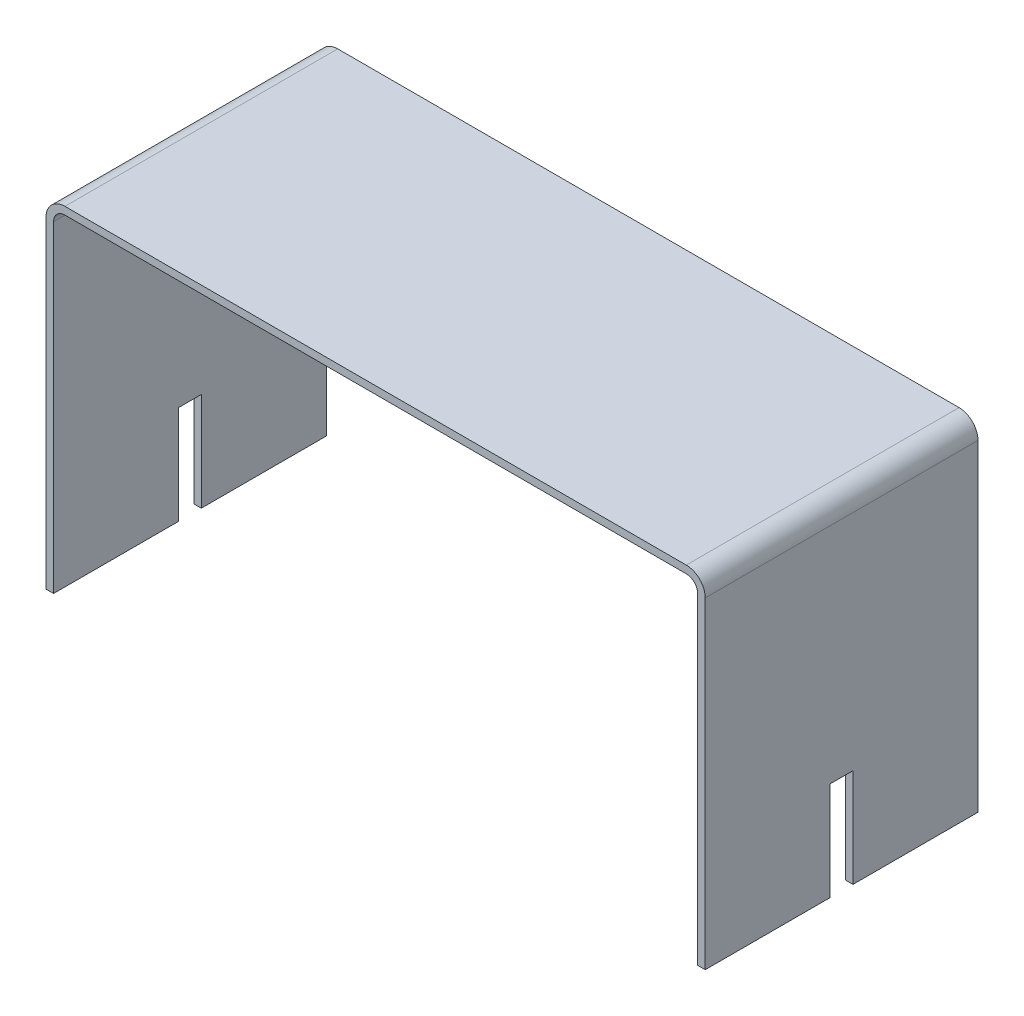
ISO-10303-21;
HEADER;
FILE_DESCRIPTION(('STEP AP214'),'2;1');
FILE_NAME('part.step','',(''),(''),'','','');
FILE_SCHEMA(('AUTOMOTIVE_DESIGN { 1 0 10303 214 1 1 1 1 }'));
ENDSEC;
DATA;
#1=APPLICATION_CONTEXT('core data for automotive mechanical design processes');
#2=APPLICATION_PROTOCOL_DEFINITION('international standard','automotive_design',2000,#1);
#3=PRODUCT_CONTEXT('',#1,'mechanical');
#4=PRODUCT('Part','Part','',(#3));
#5=PRODUCT_RELATED_PRODUCT_CATEGORY('part','',(#4));
#6=PRODUCT_DEFINITION_FORMATION('','',#4);
#7=PRODUCT_DEFINITION_CONTEXT('part definition',#1,'design');
#8=PRODUCT_DEFINITION('design','',#6,#7);
#9=PRODUCT_DEFINITION_SHAPE('','',#8);
#10=(LENGTH_UNIT() NAMED_UNIT(*) SI_UNIT(.MILLI.,.METRE.));
#11=(NAMED_UNIT(*) PLANE_ANGLE_UNIT() SI_UNIT($,.RADIAN.));
#12=(NAMED_UNIT(*) SI_UNIT($,.STERADIAN.) SOLID_ANGLE_UNIT());
#13=UNCERTAINTY_MEASURE_WITH_UNIT(LENGTH_MEASURE(1.E-05),#10,'distance_accuracy_value','');
#14=(GEOMETRIC_REPRESENTATION_CONTEXT(3) GLOBAL_UNCERTAINTY_ASSIGNED_CONTEXT((#13)) GLOBAL_UNIT_ASSIGNED_CONTEXT((#10,
#11,#12)) REPRESENTATION_CONTEXT('',''));
#15=CARTESIAN_POINT('',(0.,0.,0.));
#16=DIRECTION('',(0.,0.,1.));
#17=DIRECTION('',(1.,0.,0.));
#18=AXIS2_PLACEMENT_3D('',#15,#16,#17);
#19=CARTESIAN_POINT('',(42.,6.,1.5));
#20=DIRECTION('',(0.,0.,1.));
#21=DIRECTION('',(1.,0.,0.));
#22=AXIS2_PLACEMENT_3D('',#19,#20,#21);
#23=PLANE('',#22);
#24=DIRECTION('',(0.,-1.,0.));
#25=VECTOR('',#24,1.);
#26=CARTESIAN_POINT('',(43.5,27.75,1.5));
#27=LINE('',#26,#25);
#28=CARTESIAN_POINT('',(43.5,20.,1.5));
#29=VERTEX_POINT('',#28);
#30=CARTESIAN_POINT('',(43.5,7.,1.5));
#31=VERTEX_POINT('',#30);
#32=EDGE_CURVE('E324',#29,#31,#27,.T.);
#33=ORIENTED_EDGE('',*,*,#32,.T.);
#34=DIRECTION('',(-1.,0.,0.));
#35=VECTOR('',#34,1.);
#36=CARTESIAN_POINT('',(42.75,7.,1.5));
#37=LINE('',#36,#35);
#38=CARTESIAN_POINT('',(42.5,7.,1.5));
#39=VERTEX_POINT('',#38);
#40=EDGE_CURVE('E38',#31,#39,#37,.T.);
#41=ORIENTED_EDGE('',*,*,#40,.T.);
#42=DIRECTION('',(0.,1.,0.));
#43=VECTOR('',#42,1.);
#44=CARTESIAN_POINT('',(42.5,6.5,1.5));
#45=LINE('',#44,#43);
#46=CARTESIAN_POINT('',(42.5,20.,1.5));
#47=VERTEX_POINT('',#46);
#48=EDGE_CURVE('E306',#39,#47,#45,.T.);
#49=ORIENTED_EDGE('',*,*,#48,.T.);
#50=DIRECTION('',(1.,0.,0.));
#51=VECTOR('',#50,1.);
#52=CARTESIAN_POINT('',(42.,20.,1.5));
#53=LINE('',#52,#51);
#54=EDGE_CURVE('E11',#47,#29,#53,.T.);
#55=ORIENTED_EDGE('',*,*,#54,.T.);
#56=EDGE_LOOP('',(#33,#41,#49,#55));
#57=FACE_BOUND('',#56,.T.);
#58=ADVANCED_FACE('F17',(#57),#23,.F.);
#59=CARTESIAN_POINT('',(42.,20.,-1.5));
#60=DIRECTION('',(0.,1.,0.));
#61=DIRECTION('',(1.,0.,0.));
#62=AXIS2_PLACEMENT_3D('',#59,#60,#61);
#63=PLANE('',#62);
#64=DIRECTION('',(0.,0.,1.));
#65=VECTOR('',#64,1.);
#66=CARTESIAN_POINT('',(43.5,20.,-9.75));
#67=LINE('',#66,#65);
#68=CARTESIAN_POINT('',(43.5,20.,-1.5));
#69=VERTEX_POINT('',#68);
#70=EDGE_CURVE('E320',#69,#29,#67,.T.);
#71=ORIENTED_EDGE('',*,*,#70,.T.);
#72=ORIENTED_EDGE('',*,*,#54,.F.);
#73=DIRECTION('',(0.,0.,-1.));
#74=VECTOR('',#73,1.);
#75=CARTESIAN_POINT('',(42.5,20.,-9.75));
#76=LINE('',#75,#74);
#77=CARTESIAN_POINT('',(42.5,20.,-1.5));
#78=VERTEX_POINT('',#77);
#79=EDGE_CURVE('E413',#47,#78,#76,.T.);
#80=ORIENTED_EDGE('',*,*,#79,.T.);
#81=DIRECTION('',(1.,0.,0.));
#82=VECTOR('',#81,1.);
#83=CARTESIAN_POINT('',(42.,20.,-1.5));
#84=LINE('',#83,#82);
#85=EDGE_CURVE('E20',#78,#69,#84,.T.);
#86=ORIENTED_EDGE('',*,*,#85,.T.);
#87=EDGE_LOOP('',(#71,#72,#80,#86));
#88=FACE_BOUND('',#87,.T.);
#89=ADVANCED_FACE('F461',(#88),#63,.F.);
#90=CARTESIAN_POINT('',(42.,6.,-1.5));
#91=DIRECTION('',(0.,0.,1.));
#92=DIRECTION('',(1.,0.,0.));
#93=AXIS2_PLACEMENT_3D('',#90,#91,#92);
#94=PLANE('',#93);
#95=ORIENTED_EDGE('',*,*,#85,.F.);
#96=DIRECTION('',(0.,1.,0.));
#97=VECTOR('',#96,1.);
#98=CARTESIAN_POINT('',(42.5,6.5,-1.5));
#99=LINE('',#98,#97);
#100=CARTESIAN_POINT('',(42.5,7.,-1.5));
#101=VERTEX_POINT('',#100);
#102=EDGE_CURVE('E350',#101,#78,#99,.T.);
#103=ORIENTED_EDGE('',*,*,#102,.F.);
#104=DIRECTION('',(-1.,0.,0.));
#105=VECTOR('',#104,1.);
#106=CARTESIAN_POINT('',(42.75,7.,-1.5));
#107=LINE('',#106,#105);
#108=CARTESIAN_POINT('',(43.5,7.,-1.5));
#109=VERTEX_POINT('',#108);
#110=EDGE_CURVE('E351',#109,#101,#107,.T.);
#111=ORIENTED_EDGE('',*,*,#110,.F.);
#112=DIRECTION('',(0.,-1.,0.));
#113=VECTOR('',#112,1.);
#114=CARTESIAN_POINT('',(43.5,27.75,-1.5));
#115=LINE('',#114,#113);
#116=EDGE_CURVE('E323',#69,#109,#115,.T.);
#117=ORIENTED_EDGE('',*,*,#116,.F.);
#118=EDGE_LOOP('',(#95,#103,#111,#117));
#119=FACE_BOUND('',#118,.T.);
#120=ADVANCED_FACE('F465',(#119),#94,.T.);
#121=CARTESIAN_POINT('',(43.5,7.,-18.));
#122=DIRECTION('',(0.,-1.,0.));
#123=DIRECTION('',(0.,0.,-1.));
#124=AXIS2_PLACEMENT_3D('',#121,#122,#123);
#125=PLANE('',#124);
#126=ORIENTED_EDGE('',*,*,#40,.F.);
#127=DIRECTION('',(0.,0.,1.));
#128=VECTOR('',#127,1.);
#129=CARTESIAN_POINT('',(43.5,7.,-18.));
#130=LINE('',#129,#128);
#131=CARTESIAN_POINT('',(43.5,7.,18.));
#132=VERTEX_POINT('',#131);
#133=EDGE_CURVE('E291',#31,#132,#130,.T.);
#134=ORIENTED_EDGE('',*,*,#133,.T.);
#135=DIRECTION('',(-1.,0.,0.));
#136=VECTOR('',#135,1.);
#137=CARTESIAN_POINT('',(43.5,7.,18.));
#138=LINE('',#137,#136);
#139=CARTESIAN_POINT('',(42.5,7.,18.));
#140=VERTEX_POINT('',#139);
#141=EDGE_CURVE('E279',#132,#140,#138,.T.);
#142=ORIENTED_EDGE('',*,*,#141,.T.);
#143=DIRECTION('',(0.,0.,1.));
#144=VECTOR('',#143,1.);
#145=CARTESIAN_POINT('',(42.5,7.,-18.));
#146=LINE('',#145,#144);
#147=EDGE_CURVE('E302',#39,#140,#146,.T.);
#148=ORIENTED_EDGE('',*,*,#147,.F.);
#149=EDGE_LOOP('',(#126,#134,#142,#148));
#150=FACE_BOUND('',#149,.T.);
#151=ADVANCED_FACE('F475',(#150),#125,.T.);
#152=CARTESIAN_POINT('',(-42.5,49.5,-18.));
#153=DIRECTION('',(1.,0.,0.));
#154=DIRECTION('',(0.,1.,0.));
#155=AXIS2_PLACEMENT_3D('',#152,#153,#154);
#156=PLANE('',#155);
#157=DIRECTION('',(0.,-1.,0.));
#158=VECTOR('',#157,1.);
#159=CARTESIAN_POINT('',(-42.5,49.5,-18.));
#160=LINE('',#159,#158);
#161=CARTESIAN_POINT('',(-42.5,49.5,-18.));
#162=VERTEX_POINT('',#161);
#163=CARTESIAN_POINT('',(-42.5,7.,-18.));
#164=VERTEX_POINT('',#163);
#165=EDGE_CURVE('E209',#162,#164,#160,.T.);
#166=ORIENTED_EDGE('',*,*,#165,.F.);
#167=DIRECTION('',(0.,0.,1.));
#168=VECTOR('',#167,1.);
#169=CARTESIAN_POINT('',(-42.5,49.5,-18.));
#170=LINE('',#169,#168);
#171=CARTESIAN_POINT('',(-42.5,49.5,18.));
#172=VERTEX_POINT('',#171);
#173=EDGE_CURVE('E315',#162,#172,#170,.T.);
#174=ORIENTED_EDGE('',*,*,#173,.T.);
#175=DIRECTION('',(0.,-1.,0.));
#176=VECTOR('',#175,1.);
#177=CARTESIAN_POINT('',(-42.5,49.5,18.));
#178=LINE('',#177,#176);
#179=CARTESIAN_POINT('',(-42.5,7.,18.));
#180=VERTEX_POINT('',#179);
#181=EDGE_CURVE('E341',#172,#180,#178,.T.);
#182=ORIENTED_EDGE('',*,*,#181,.T.);
#183=DIRECTION('',(0.,0.,1.));
#184=VECTOR('',#183,1.);
#185=CARTESIAN_POINT('',(-42.5,7.,-18.));
#186=LINE('',#185,#184);
#187=CARTESIAN_POINT('',(-42.5,7.,1.5));
#188=VERTEX_POINT('',#187);
#189=EDGE_CURVE('E335',#188,#180,#186,.T.);
#190=ORIENTED_EDGE('',*,*,#189,.F.);
#191=DIRECTION('',(0.,-1.,0.));
#192=VECTOR('',#191,1.);
#193=CARTESIAN_POINT('',(-42.5,27.75,1.5));
#194=LINE('',#193,#192);
#195=CARTESIAN_POINT('',(-42.5,20.,1.5));
#196=VERTEX_POINT('',#195);
#197=EDGE_CURVE('E330',#196,#188,#194,.T.);
#198=ORIENTED_EDGE('',*,*,#197,.F.);
#199=DIRECTION('',(0.,0.,1.));
#200=VECTOR('',#199,1.);
#201=CARTESIAN_POINT('',(-42.5,20.,-9.75));
#202=LINE('',#201,#200);
#203=CARTESIAN_POINT('',(-42.5,20.,-1.5));
#204=VERTEX_POINT('',#203);
#205=EDGE_CURVE('E329',#204,#196,#202,.T.);
#206=ORIENTED_EDGE('',*,*,#205,.F.);
#207=DIRECTION('',(0.,-1.,0.));
#208=VECTOR('',#207,1.);
#209=CARTESIAN_POINT('',(-42.5,27.75,-1.5));
#210=LINE('',#209,#208);
#211=CARTESIAN_POINT('',(-42.5,7.,-1.5));
#212=VERTEX_POINT('',#211);
#213=EDGE_CURVE('E250',#204,#212,#210,.T.);
#214=ORIENTED_EDGE('',*,*,#213,.T.);
#215=DIRECTION('',(0.,0.,1.));
#216=VECTOR('',#215,1.);
#217=CARTESIAN_POINT('',(-42.5,7.,-18.));
#218=LINE('',#217,#216);
#219=EDGE_CURVE('E246',#164,#212,#218,.T.);
#220=ORIENTED_EDGE('',*,*,#219,.F.);
#221=EDGE_LOOP('',(#166,#174,#182,#190,#198,#206,#214,#220));
#222=FACE_BOUND('',#221,.T.);
#223=ADVANCED_FACE('F423',(#222),#156,.T.);
#224=CARTESIAN_POINT('',(-41.,49.5,-18.));
#225=DIRECTION('',(0.,0.,-1.));
#226=DIRECTION('',(0.,1.,0.));
#227=AXIS2_PLACEMENT_3D('',#224,#225,#226);
#228=CYLINDRICAL_SURFACE('',#227,1.5);
#229=DIRECTION('',(0.,0.,1.));
#230=VECTOR('',#229,1.);
#231=CARTESIAN_POINT('',(-41.,51.,-18.));
#232=LINE('',#231,#230);
#233=CARTESIAN_POINT('',(-41.,51.,-18.));
#234=VERTEX_POINT('',#233);
#235=CARTESIAN_POINT('',(-41.,51.,18.));
#236=VERTEX_POINT('',#235);
#237=EDGE_CURVE('E311',#234,#236,#232,.T.);
#238=ORIENTED_EDGE('',*,*,#237,.T.);
#239=CARTESIAN_POINT('',(-41.,49.5,18.));
#240=DIRECTION('',(0.,0.,1.));
#241=DIRECTION('',(0.,1.,0.));
#242=AXIS2_PLACEMENT_3D('',#239,#240,#241);
#243=CIRCLE('',#242,1.5);
#244=EDGE_CURVE('E345',#236,#172,#243,.T.);
#245=ORIENTED_EDGE('',*,*,#244,.T.);
#246=ORIENTED_EDGE('',*,*,#173,.F.);
#247=CARTESIAN_POINT('',(-41.,49.5,-18.));
#248=DIRECTION('',(0.,0.,1.));
#249=DIRECTION('',(0.,1.,0.));
#250=AXIS2_PLACEMENT_3D('',#247,#248,#249);
#251=CIRCLE('',#250,1.5);
#252=EDGE_CURVE('E235',#234,#162,#251,.T.);
#253=ORIENTED_EDGE('',*,*,#252,.F.);
#254=EDGE_LOOP('',(#238,#245,#246,#253));
#255=FACE_BOUND('',#254,.T.);
#256=ADVANCED_FACE('F430',(#255),#228,.F.);
#257=CARTESIAN_POINT('',(41.,51.,-18.));
#258=DIRECTION('',(0.,-1.,0.));
#259=DIRECTION('',(0.,0.,-1.));
#260=AXIS2_PLACEMENT_3D('',#257,#258,#259);
#261=PLANE('',#260);
#262=DIRECTION('',(0.,0.,1.));
#263=VECTOR('',#262,1.);
#264=CARTESIAN_POINT('',(41.,51.,-18.));
#265=LINE('',#264,#263);
#266=CARTESIAN_POINT('',(41.,51.,-18.));
#267=VERTEX_POINT('',#266);
#268=CARTESIAN_POINT('',(41.,51.,18.));
#269=VERTEX_POINT('',#268);
#270=EDGE_CURVE('E309',#267,#269,#265,.T.);
#271=ORIENTED_EDGE('',*,*,#270,.T.);
#272=DIRECTION('',(-1.,0.,0.));
#273=VECTOR('',#272,1.);
#274=CARTESIAN_POINT('',(41.,51.,18.));
#275=LINE('',#274,#273);
#276=EDGE_CURVE('E355',#269,#236,#275,.T.);
#277=ORIENTED_EDGE('',*,*,#276,.T.);
#278=ORIENTED_EDGE('',*,*,#237,.F.);
#279=DIRECTION('',(-1.,0.,0.));
#280=VECTOR('',#279,1.);
#281=CARTESIAN_POINT('',(41.,51.,-18.));
#282=LINE('',#281,#280);
#283=EDGE_CURVE('E236',#267,#234,#282,.T.);
#284=ORIENTED_EDGE('',*,*,#283,.F.);
#285=EDGE_LOOP('',(#271,#277,#278,#284));
#286=FACE_BOUND('',#285,.T.);
#287=ADVANCED_FACE('F498',(#286),#261,.T.);
#288=CARTESIAN_POINT('',(41.,49.5,-18.));
#289=DIRECTION('',(0.,0.,-1.));
#290=DIRECTION('',(1.,0.,0.));
#291=AXIS2_PLACEMENT_3D('',#288,#289,#290);
#292=CYLINDRICAL_SURFACE('',#291,1.5);
#293=DIRECTION('',(0.,0.,1.));
#294=VECTOR('',#293,1.);
#295=CARTESIAN_POINT('',(42.5,49.5,-18.));
#296=LINE('',#295,#294);
#297=CARTESIAN_POINT('',(42.5,49.5,-18.));
#298=VERTEX_POINT('',#297);
#299=CARTESIAN_POINT('',(42.5,49.5,18.));
#300=VERTEX_POINT('',#299);
#301=EDGE_CURVE('E305',#298,#300,#296,.T.);
#302=ORIENTED_EDGE('',*,*,#301,.T.);
#303=CARTESIAN_POINT('',(41.,49.5,18.));
#304=DIRECTION('',(0.,0.,1.));
#305=DIRECTION('',(1.,0.,0.));
#306=AXIS2_PLACEMENT_3D('',#303,#304,#305);
#307=CIRCLE('',#306,1.5);
#308=EDGE_CURVE('E359',#300,#269,#307,.T.);
#309=ORIENTED_EDGE('',*,*,#308,.T.);
#310=ORIENTED_EDGE('',*,*,#270,.F.);
#311=CARTESIAN_POINT('',(41.,49.5,-18.));
#312=DIRECTION('',(0.,0.,1.));
#313=DIRECTION('',(1.,0.,0.));
#314=AXIS2_PLACEMENT_3D('',#311,#312,#313);
#315=CIRCLE('',#314,1.5);
#316=EDGE_CURVE('E295',#298,#267,#315,.T.);
#317=ORIENTED_EDGE('',*,*,#316,.F.);
#318=EDGE_LOOP('',(#302,#309,#310,#317));
#319=FACE_BOUND('',#318,.T.);
#320=ADVANCED_FACE('F495',(#319),#292,.F.);
#321=CARTESIAN_POINT('',(42.5,7.,-18.));
#322=DIRECTION('',(-1.,0.,0.));
#323=DIRECTION('',(0.,0.,1.));
#324=AXIS2_PLACEMENT_3D('',#321,#322,#323);
#325=PLANE('',#324);
#326=DIRECTION('',(0.,1.,0.));
#327=VECTOR('',#326,1.);
#328=CARTESIAN_POINT('',(42.5,7.,-18.));
#329=LINE('',#328,#327);
#330=CARTESIAN_POINT('',(42.5,7.,-18.));
#331=VERTEX_POINT('',#330);
#332=EDGE_CURVE('E273',#331,#298,#329,.T.);
#333=ORIENTED_EDGE('',*,*,#332,.F.);
#334=DIRECTION('',(0.,0.,1.));
#335=VECTOR('',#334,1.);
#336=CARTESIAN_POINT('',(42.5,7.,-18.));
#337=LINE('',#336,#335);
#338=EDGE_CURVE('E346',#331,#101,#337,.T.);
#339=ORIENTED_EDGE('',*,*,#338,.T.);
#340=ORIENTED_EDGE('',*,*,#102,.T.);
#341=ORIENTED_EDGE('',*,*,#79,.F.);
#342=ORIENTED_EDGE('',*,*,#48,.F.);
#343=ORIENTED_EDGE('',*,*,#147,.T.);
#344=DIRECTION('',(0.,1.,0.));
#345=VECTOR('',#344,1.);
#346=CARTESIAN_POINT('',(42.5,7.,18.));
#347=LINE('',#346,#345);
#348=EDGE_CURVE('E363',#140,#300,#347,.T.);
#349=ORIENTED_EDGE('',*,*,#348,.T.);
#350=ORIENTED_EDGE('',*,*,#301,.F.);
#351=EDGE_LOOP('',(#333,#339,#340,#341,#342,#343,#349,#350));
#352=FACE_BOUND('',#351,.T.);
#353=ADVANCED_FACE('F481',(#352),#325,.T.);
#354=CARTESIAN_POINT('',(43.5,7.,-18.));
#355=DIRECTION('',(0.,-1.,0.));
#356=DIRECTION('',(0.,0.,-1.));
#357=AXIS2_PLACEMENT_3D('',#354,#355,#356);
#358=PLANE('',#357);
#359=DIRECTION('',(-1.,0.,0.));
#360=VECTOR('',#359,1.);
#361=CARTESIAN_POINT('',(43.5,7.,-18.));
#362=LINE('',#361,#360);
#363=CARTESIAN_POINT('',(43.5,7.,-18.));
#364=VERTEX_POINT('',#363);
#365=EDGE_CURVE('E269',#364,#331,#362,.T.);
#366=ORIENTED_EDGE('',*,*,#365,.F.);
#367=DIRECTION('',(0.,0.,1.));
#368=VECTOR('',#367,1.);
#369=CARTESIAN_POINT('',(43.5,7.,-18.));
#370=LINE('',#369,#368);
#371=EDGE_CURVE('E403',#364,#109,#370,.T.);
#372=ORIENTED_EDGE('',*,*,#371,.T.);
#373=ORIENTED_EDGE('',*,*,#110,.T.);
#374=ORIENTED_EDGE('',*,*,#338,.F.);
#375=EDGE_LOOP('',(#366,#372,#373,#374));
#376=FACE_BOUND('',#375,.T.);
#377=ADVANCED_FACE('F486',(#376),#358,.T.);
#378=CARTESIAN_POINT('',(43.5,49.5,-18.));
#379=DIRECTION('',(1.,0.,0.));
#380=DIRECTION('',(0.,1.,0.));
#381=AXIS2_PLACEMENT_3D('',#378,#379,#380);
#382=PLANE('',#381);
#383=DIRECTION('',(0.,-1.,0.));
#384=VECTOR('',#383,1.);
#385=CARTESIAN_POINT('',(43.5,49.5,-18.));
#386=LINE('',#385,#384);
#387=CARTESIAN_POINT('',(43.5,49.5,-18.));
#388=VERTEX_POINT('',#387);
#389=EDGE_CURVE('E264',#388,#364,#386,.T.);
#390=ORIENTED_EDGE('',*,*,#389,.F.);
#391=DIRECTION('',(0.,0.,1.));
#392=VECTOR('',#391,1.);
#393=CARTESIAN_POINT('',(43.5,49.5,-18.));
#394=LINE('',#393,#392);
#395=CARTESIAN_POINT('',(43.5,49.5,18.));
#396=VERTEX_POINT('',#395);
#397=EDGE_CURVE('E288',#388,#396,#394,.T.);
#398=ORIENTED_EDGE('',*,*,#397,.T.);
#399=DIRECTION('',(0.,-1.,0.));
#400=VECTOR('',#399,1.);
#401=CARTESIAN_POINT('',(43.5,49.5,18.));
#402=LINE('',#401,#400);
#403=EDGE_CURVE('E274',#396,#132,#402,.T.);
#404=ORIENTED_EDGE('',*,*,#403,.T.);
#405=ORIENTED_EDGE('',*,*,#133,.F.);
#406=ORIENTED_EDGE('',*,*,#32,.F.);
#407=ORIENTED_EDGE('',*,*,#70,.F.);
#408=ORIENTED_EDGE('',*,*,#116,.T.);
#409=ORIENTED_EDGE('',*,*,#371,.F.);
#410=EDGE_LOOP('',(#390,#398,#404,#405,#406,#407,#408,#409));
#411=FACE_BOUND('',#410,.T.);
#412=ADVANCED_FACE('F471',(#411),#382,.T.);
#413=CARTESIAN_POINT('',(41.,49.5,-18.));
#414=DIRECTION('',(0.,0.,-1.));
#415=DIRECTION('',(0.,1.,0.));
#416=AXIS2_PLACEMENT_3D('',#413,#414,#415);
#417=CYLINDRICAL_SURFACE('',#416,2.5);
#418=DIRECTION('',(0.,0.,1.));
#419=VECTOR('',#418,1.);
#420=CARTESIAN_POINT('',(41.,52.,-18.));
#421=LINE('',#420,#419);
#422=CARTESIAN_POINT('',(41.,52.,-18.));
#423=VERTEX_POINT('',#422);
#424=CARTESIAN_POINT('',(41.,52.,18.));
#425=VERTEX_POINT('',#424);
#426=EDGE_CURVE('E249',#423,#425,#421,.T.);
#427=ORIENTED_EDGE('',*,*,#426,.T.);
#428=CARTESIAN_POINT('',(41.,49.5,18.));
#429=DIRECTION('',(0.,0.,-1.));
#430=DIRECTION('',(0.,1.,0.));
#431=AXIS2_PLACEMENT_3D('',#428,#429,#430);
#432=CIRCLE('',#431,2.5);
#433=EDGE_CURVE('E278',#425,#396,#432,.T.);
#434=ORIENTED_EDGE('',*,*,#433,.T.);
#435=ORIENTED_EDGE('',*,*,#397,.F.);
#436=CARTESIAN_POINT('',(41.,49.5,-18.));
#437=DIRECTION('',(0.,0.,-1.));
#438=DIRECTION('',(0.,1.,0.));
#439=AXIS2_PLACEMENT_3D('',#436,#437,#438);
#440=CIRCLE('',#439,2.5);
#441=EDGE_CURVE('E260',#423,#388,#440,.T.);
#442=ORIENTED_EDGE('',*,*,#441,.F.);
#443=EDGE_LOOP('',(#427,#434,#435,#442));
#444=FACE_BOUND('',#443,.T.);
#445=ADVANCED_FACE('F490',(#444),#417,.T.);
#446=CARTESIAN_POINT('',(-41.,52.,-18.));
#447=DIRECTION('',(0.,1.,0.));
#448=DIRECTION('',(1.,0.,0.));
#449=AXIS2_PLACEMENT_3D('',#446,#447,#448);
#450=PLANE('',#449);
#451=DIRECTION('',(0.,0.,1.));
#452=VECTOR('',#451,1.);
#453=CARTESIAN_POINT('',(-41.,52.,-18.));
#454=LINE('',#453,#452);
#455=CARTESIAN_POINT('',(-41.,52.,-18.));
#456=VERTEX_POINT('',#455);
#457=CARTESIAN_POINT('',(-41.,52.,18.));
#458=VERTEX_POINT('',#457);
#459=EDGE_CURVE('E319',#456,#458,#454,.T.);
#460=ORIENTED_EDGE('',*,*,#459,.T.);
#461=DIRECTION('',(1.,0.,0.));
#462=VECTOR('',#461,1.);
#463=CARTESIAN_POINT('',(-41.,52.,18.));
#464=LINE('',#463,#462);
#465=EDGE_CURVE('E375',#458,#425,#464,.T.);
#466=ORIENTED_EDGE('',*,*,#465,.T.);
#467=ORIENTED_EDGE('',*,*,#426,.F.);
#468=DIRECTION('',(1.,0.,0.));
#469=VECTOR('',#468,1.);
#470=CARTESIAN_POINT('',(-41.,52.,-18.));
#471=LINE('',#470,#469);
#472=EDGE_CURVE('E265',#456,#423,#471,.T.);
#473=ORIENTED_EDGE('',*,*,#472,.F.);
#474=EDGE_LOOP('',(#460,#466,#467,#473));
#475=FACE_BOUND('',#474,.T.);
#476=ADVANCED_FACE('F457',(#475),#450,.T.);
#477=CARTESIAN_POINT('',(-42.5,7.,-18.));
#478=DIRECTION('',(0.,-1.,0.));
#479=DIRECTION('',(0.,0.,-1.));
#480=AXIS2_PLACEMENT_3D('',#477,#478,#479);
#481=PLANE('',#480);
#482=DIRECTION('',(-1.,0.,0.));
#483=VECTOR('',#482,1.);
#484=CARTESIAN_POINT('',(-42.5,7.,-18.));
#485=LINE('',#484,#483);
#486=CARTESIAN_POINT('',(-43.5,7.,-18.));
#487=VERTEX_POINT('',#486);
#488=EDGE_CURVE('E201',#164,#487,#485,.T.);
#489=ORIENTED_EDGE('',*,*,#488,.F.);
#490=ORIENTED_EDGE('',*,*,#219,.T.);
#491=DIRECTION('',(-1.,0.,0.));
#492=VECTOR('',#491,1.);
#493=CARTESIAN_POINT('',(-43.25,7.,-1.5));
#494=LINE('',#493,#492);
#495=CARTESIAN_POINT('',(-43.5,7.,-1.5));
#496=VERTEX_POINT('',#495);
#497=EDGE_CURVE('E218',#212,#496,#494,.T.);
#498=ORIENTED_EDGE('',*,*,#497,.T.);
#499=DIRECTION('',(0.,0.,1.));
#500=VECTOR('',#499,1.);
#501=CARTESIAN_POINT('',(-43.5,7.,-18.));
#502=LINE('',#501,#500);
#503=EDGE_CURVE('E215',#487,#496,#502,.T.);
#504=ORIENTED_EDGE('',*,*,#503,.F.);
#505=EDGE_LOOP('',(#489,#490,#498,#504));
#506=FACE_BOUND('',#505,.T.);
#507=ADVANCED_FACE('F216',(#506),#481,.T.);
#508=CARTESIAN_POINT('',(-44.,6.,-1.5));
#509=DIRECTION('',(0.,0.,1.));
#510=DIRECTION('',(1.,0.,0.));
#511=AXIS2_PLACEMENT_3D('',#508,#509,#510);
#512=PLANE('',#511);
#513=DIRECTION('',(1.,0.,0.));
#514=VECTOR('',#513,1.);
#515=CARTESIAN_POINT('',(-44.,20.,-1.5));
#516=LINE('',#515,#514);
#517=CARTESIAN_POINT('',(-43.5,20.,-1.5));
#518=VERTEX_POINT('',#517);
#519=EDGE_CURVE('E385',#518,#204,#516,.T.);
#520=ORIENTED_EDGE('',*,*,#519,.F.);
#521=DIRECTION('',(0.,1.,0.));
#522=VECTOR('',#521,1.);
#523=CARTESIAN_POINT('',(-43.5,6.5,-1.5));
#524=LINE('',#523,#522);
#525=EDGE_CURVE('E223',#496,#518,#524,.T.);
#526=ORIENTED_EDGE('',*,*,#525,.F.);
#527=ORIENTED_EDGE('',*,*,#497,.F.);
#528=ORIENTED_EDGE('',*,*,#213,.F.);
#529=EDGE_LOOP('',(#520,#526,#527,#528));
#530=FACE_BOUND('',#529,.T.);
#531=ADVANCED_FACE('F448',(#530),#512,.T.);
#532=CARTESIAN_POINT('',(-44.,20.,-1.5));
#533=DIRECTION('',(0.,1.,0.));
#534=DIRECTION('',(1.,0.,0.));
#535=AXIS2_PLACEMENT_3D('',#532,#533,#534);
#536=PLANE('',#535);
#537=ORIENTED_EDGE('',*,*,#205,.T.);
#538=DIRECTION('',(1.,0.,0.));
#539=VECTOR('',#538,1.);
#540=CARTESIAN_POINT('',(-44.,20.,1.5));
#541=LINE('',#540,#539);
#542=CARTESIAN_POINT('',(-43.5,20.,1.5));
#543=VERTEX_POINT('',#542);
#544=EDGE_CURVE('E325',#543,#196,#541,.T.);
#545=ORIENTED_EDGE('',*,*,#544,.F.);
#546=DIRECTION('',(0.,0.,-1.));
#547=VECTOR('',#546,1.);
#548=CARTESIAN_POINT('',(-43.5,20.,-9.75));
#549=LINE('',#548,#547);
#550=EDGE_CURVE('E243',#543,#518,#549,.T.);
#551=ORIENTED_EDGE('',*,*,#550,.T.);
#552=ORIENTED_EDGE('',*,*,#519,.T.);
#553=EDGE_LOOP('',(#537,#545,#551,#552));
#554=FACE_BOUND('',#553,.T.);
#555=ADVANCED_FACE('F446',(#554),#536,.F.);
#556=CARTESIAN_POINT('',(-44.,6.,1.5));
#557=DIRECTION('',(0.,0.,1.));
#558=DIRECTION('',(1.,0.,0.));
#559=AXIS2_PLACEMENT_3D('',#556,#557,#558);
#560=PLANE('',#559);
#561=ORIENTED_EDGE('',*,*,#197,.T.);
#562=DIRECTION('',(-1.,0.,0.));
#563=VECTOR('',#562,1.);
#564=CARTESIAN_POINT('',(-43.25,7.,1.5));
#565=LINE('',#564,#563);
#566=CARTESIAN_POINT('',(-43.5,7.,1.5));
#567=VERTEX_POINT('',#566);
#568=EDGE_CURVE('E338',#188,#567,#565,.T.);
#569=ORIENTED_EDGE('',*,*,#568,.T.);
#570=DIRECTION('',(0.,1.,0.));
#571=VECTOR('',#570,1.);
#572=CARTESIAN_POINT('',(-43.5,6.5,1.5));
#573=LINE('',#572,#571);
#574=EDGE_CURVE('E238',#567,#543,#573,.T.);
#575=ORIENTED_EDGE('',*,*,#574,.T.);
#576=ORIENTED_EDGE('',*,*,#544,.T.);
#577=EDGE_LOOP('',(#561,#569,#575,#576));
#578=FACE_BOUND('',#577,.T.);
#579=ADVANCED_FACE('F443',(#578),#560,.F.);
#580=CARTESIAN_POINT('',(-42.5,7.,-18.));
#581=DIRECTION('',(0.,-1.,0.));
#582=DIRECTION('',(0.,0.,-1.));
#583=AXIS2_PLACEMENT_3D('',#580,#581,#582);
#584=PLANE('',#583);
#585=ORIENTED_EDGE('',*,*,#568,.F.);
#586=ORIENTED_EDGE('',*,*,#189,.T.);
#587=DIRECTION('',(-1.,0.,0.));
#588=VECTOR('',#587,1.);
#589=CARTESIAN_POINT('',(-42.5,7.,18.));
#590=LINE('',#589,#588);
#591=CARTESIAN_POINT('',(-43.5,7.,18.));
#592=VERTEX_POINT('',#591);
#593=EDGE_CURVE('E334',#180,#592,#590,.T.);
#594=ORIENTED_EDGE('',*,*,#593,.T.);
#595=DIRECTION('',(0.,0.,1.));
#596=VECTOR('',#595,1.);
#597=CARTESIAN_POINT('',(-43.5,7.,-18.));
#598=LINE('',#597,#596);
#599=EDGE_CURVE('E242',#567,#592,#598,.T.);
#600=ORIENTED_EDGE('',*,*,#599,.F.);
#601=EDGE_LOOP('',(#585,#586,#594,#600));
#602=FACE_BOUND('',#601,.T.);
#603=ADVANCED_FACE('F438',(#602),#584,.T.);
#604=CARTESIAN_POINT('',(0.,39.87642108138,18.));
#605=DIRECTION('',(0.,0.,-1.));
#606=DIRECTION('',(0.,-1.,0.));
#607=AXIS2_PLACEMENT_3D('',#604,#605,#606);
#608=PLANE('',#607);
#609=ORIENTED_EDGE('',*,*,#593,.F.);
#610=ORIENTED_EDGE('',*,*,#181,.F.);
#611=ORIENTED_EDGE('',*,*,#244,.F.);
#612=ORIENTED_EDGE('',*,*,#276,.F.);
#613=ORIENTED_EDGE('',*,*,#308,.F.);
#614=ORIENTED_EDGE('',*,*,#348,.F.);
#615=ORIENTED_EDGE('',*,*,#141,.F.);
#616=ORIENTED_EDGE('',*,*,#403,.F.);
#617=ORIENTED_EDGE('',*,*,#433,.F.);
#618=ORIENTED_EDGE('',*,*,#465,.F.);
#619=CARTESIAN_POINT('',(-41.,49.5,18.));
#620=DIRECTION('',(0.,0.,-1.));
#621=DIRECTION('',(-1.,0.,0.));
#622=AXIS2_PLACEMENT_3D('',#619,#620,#621);
#623=CIRCLE('',#622,2.5);
#624=CARTESIAN_POINT('',(-43.5,49.5,18.));
#625=VERTEX_POINT('',#624);
#626=EDGE_CURVE('E212',#625,#458,#623,.T.);
#627=ORIENTED_EDGE('',*,*,#626,.F.);
#628=DIRECTION('',(0.,1.,0.));
#629=VECTOR('',#628,1.);
#630=CARTESIAN_POINT('',(-43.5,7.,18.));
#631=LINE('',#630,#629);
#632=EDGE_CURVE('E254',#592,#625,#631,.T.);
#633=ORIENTED_EDGE('',*,*,#632,.F.);
#634=EDGE_LOOP('',(#609,#610,#611,#612,#613,#614,#615,#616,#617,#618,#627,#633));
#635=FACE_BOUND('',#634,.T.);
#636=ADVANCED_FACE('F433',(#635),#608,.F.);
#637=CARTESIAN_POINT('',(-41.,49.5,-18.));
#638=DIRECTION('',(0.,0.,-1.));
#639=DIRECTION('',(-1.,0.,0.));
#640=AXIS2_PLACEMENT_3D('',#637,#638,#639);
#641=CYLINDRICAL_SURFACE('',#640,2.5);
#642=DIRECTION('',(0.,0.,1.));
#643=VECTOR('',#642,1.);
#644=CARTESIAN_POINT('',(-43.5,49.5,-18.));
#645=LINE('',#644,#643);
#646=CARTESIAN_POINT('',(-43.5,49.5,-18.));
#647=VERTEX_POINT('',#646);
#648=EDGE_CURVE('E229',#647,#625,#645,.T.);
#649=ORIENTED_EDGE('',*,*,#648,.T.);
#650=ORIENTED_EDGE('',*,*,#626,.T.);
#651=ORIENTED_EDGE('',*,*,#459,.F.);
#652=CARTESIAN_POINT('',(-41.,49.5,-18.));
#653=DIRECTION('',(0.,0.,-1.));
#654=DIRECTION('',(-1.,0.,0.));
#655=AXIS2_PLACEMENT_3D('',#652,#653,#654);
#656=CIRCLE('',#655,2.5);
#657=EDGE_CURVE('E268',#647,#456,#656,.T.);
#658=ORIENTED_EDGE('',*,*,#657,.F.);
#659=EDGE_LOOP('',(#649,#650,#651,#658));
#660=FACE_BOUND('',#659,.T.);
#661=ADVANCED_FACE('F632',(#660),#641,.T.);
#662=CARTESIAN_POINT('',(0.,39.87642108138,-18.));
#663=DIRECTION('',(0.,0.,-1.));
#664=DIRECTION('',(0.,-1.,0.));
#665=AXIS2_PLACEMENT_3D('',#662,#663,#664);
#666=PLANE('',#665);
#667=DIRECTION('',(0.,1.,0.));
#668=VECTOR('',#667,1.);
#669=CARTESIAN_POINT('',(-43.5,7.,-18.));
#670=LINE('',#669,#668);
#671=EDGE_CURVE('E206',#487,#647,#670,.T.);
#672=ORIENTED_EDGE('',*,*,#671,.T.);
#673=ORIENTED_EDGE('',*,*,#657,.T.);
#674=ORIENTED_EDGE('',*,*,#472,.T.);
#675=ORIENTED_EDGE('',*,*,#441,.T.);
#676=ORIENTED_EDGE('',*,*,#389,.T.);
#677=ORIENTED_EDGE('',*,*,#365,.T.);
#678=ORIENTED_EDGE('',*,*,#332,.T.);
#679=ORIENTED_EDGE('',*,*,#316,.T.);
#680=ORIENTED_EDGE('',*,*,#283,.T.);
#681=ORIENTED_EDGE('',*,*,#252,.T.);
#682=ORIENTED_EDGE('',*,*,#165,.T.);
#683=ORIENTED_EDGE('',*,*,#488,.T.);
#684=EDGE_LOOP('',(#672,#673,#674,#675,#676,#677,#678,#679,#680,#681,#682,#683));
#685=FACE_BOUND('',#684,.T.);
#686=ADVANCED_FACE('F203',(#685),#666,.T.);
#687=CARTESIAN_POINT('',(-43.5,7.,-18.));
#688=DIRECTION('',(-1.,0.,0.));
#689=DIRECTION('',(0.,0.,1.));
#690=AXIS2_PLACEMENT_3D('',#687,#688,#689);
#691=PLANE('',#690);
#692=ORIENTED_EDGE('',*,*,#671,.F.);
#693=ORIENTED_EDGE('',*,*,#503,.T.);
#694=ORIENTED_EDGE('',*,*,#525,.T.);
#695=ORIENTED_EDGE('',*,*,#550,.F.);
#696=ORIENTED_EDGE('',*,*,#574,.F.);
#697=ORIENTED_EDGE('',*,*,#599,.T.);
#698=ORIENTED_EDGE('',*,*,#632,.T.);
#699=ORIENTED_EDGE('',*,*,#648,.F.);
#700=EDGE_LOOP('',(#692,#693,#694,#695,#696,#697,#698,#699));
#701=FACE_BOUND('',#700,.T.);
#702=ADVANCED_FACE('F226',(#701),#691,.T.);
#703=CLOSED_SHELL('',(#58,#89,#120,#151,#223,#256,#287,#320,#353,#377,#412,#445,#476,#507,#531,
#555,#579,#603,#636,#661,#686,#702));
#704=MANIFOLD_SOLID_BREP('B1',#703);
#705=ADVANCED_BREP_SHAPE_REPRESENTATION('',(#18,#704),#14);
#706=SHAPE_DEFINITION_REPRESENTATION(#9,#705);
ENDSEC;
END-ISO-10303-21;
